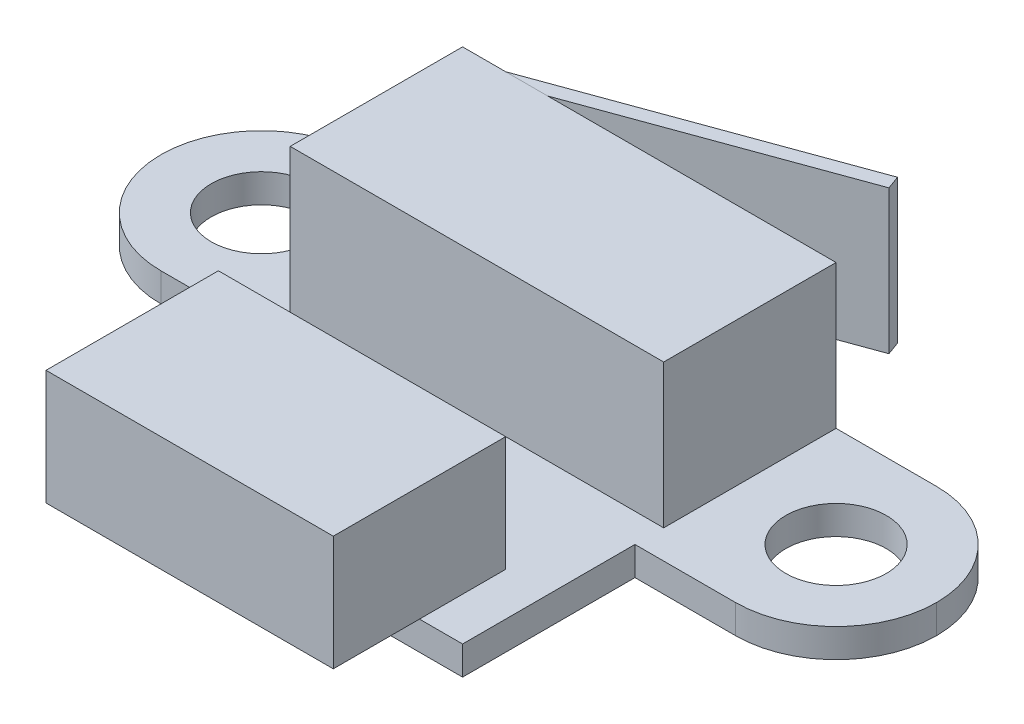
ISO-10303-21;
HEADER;
FILE_DESCRIPTION(('STEP AP214'),'2;1');
FILE_NAME('part.step','',(''),(''),'','','');
FILE_SCHEMA(('AUTOMOTIVE_DESIGN { 1 0 10303 214 1 1 1 1 }'));
ENDSEC;
DATA;
#1=APPLICATION_CONTEXT('core data for automotive mechanical design processes');
#2=APPLICATION_PROTOCOL_DEFINITION('international standard','automotive_design',2000,#1);
#3=PRODUCT_CONTEXT('',#1,'mechanical');
#4=PRODUCT('Part','Part','',(#3));
#5=PRODUCT_RELATED_PRODUCT_CATEGORY('part','',(#4));
#6=PRODUCT_DEFINITION_FORMATION('','',#4);
#7=PRODUCT_DEFINITION_CONTEXT('part definition',#1,'design');
#8=PRODUCT_DEFINITION('design','',#6,#7);
#9=PRODUCT_DEFINITION_SHAPE('','',#8);
#10=(LENGTH_UNIT() NAMED_UNIT(*) SI_UNIT(.MILLI.,.METRE.));
#11=(NAMED_UNIT(*) PLANE_ANGLE_UNIT() SI_UNIT($,.RADIAN.));
#12=(NAMED_UNIT(*) SI_UNIT($,.STERADIAN.) SOLID_ANGLE_UNIT());
#13=UNCERTAINTY_MEASURE_WITH_UNIT(LENGTH_MEASURE(1.E-05),#10,'distance_accuracy_value','');
#14=(GEOMETRIC_REPRESENTATION_CONTEXT(3) GLOBAL_UNCERTAINTY_ASSIGNED_CONTEXT((#13)) GLOBAL_UNIT_ASSIGNED_CONTEXT((#10,
#11,#12)) REPRESENTATION_CONTEXT('',''));
#15=CARTESIAN_POINT('',(0.,0.,0.));
#16=DIRECTION('',(0.,0.,1.));
#17=DIRECTION('',(1.,0.,0.));
#18=AXIS2_PLACEMENT_3D('',#15,#16,#17);
#19=CARTESIAN_POINT('',(-3.53809779991842,1.,-6.5));
#20=DIRECTION('',(0.,0.,1.));
#21=DIRECTION('',(1.,0.,0.));
#22=AXIS2_PLACEMENT_3D('',#19,#20,#21);
#23=PLANE('',#22);
#24=DIRECTION('',(1.,0.,0.));
#25=VECTOR('',#24,1.);
#26=CARTESIAN_POINT('',(-3.53809779991842,6.,-6.5));
#27=LINE('',#26,#25);
#28=CARTESIAN_POINT('',(-5.,6.,-6.5));
#29=VERTEX_POINT('',#28);
#30=CARTESIAN_POINT('',(-3.53809779991842,6.,-6.5));
#31=VERTEX_POINT('',#30);
#32=EDGE_CURVE('E106',#29,#31,#27,.T.);
#33=ORIENTED_EDGE('',*,*,#32,.F.);
#34=DIRECTION('',(0.,1.,0.));
#35=VECTOR('',#34,1.);
#36=CARTESIAN_POINT('',(-5.,1.,-6.5));
#37=LINE('',#36,#35);
#38=CARTESIAN_POINT('',(-5.,1.,-6.5));
#39=VERTEX_POINT('',#38);
#40=EDGE_CURVE('E12',#39,#29,#37,.T.);
#41=ORIENTED_EDGE('',*,*,#40,.F.);
#42=DIRECTION('',(1.,0.,0.));
#43=VECTOR('',#42,1.);
#44=CARTESIAN_POINT('',(-3.53809779991842,1.,-6.5));
#45=LINE('',#44,#43);
#46=CARTESIAN_POINT('',(-3.53809779991842,1.,-6.5));
#47=VERTEX_POINT('',#46);
#48=EDGE_CURVE('E100',#39,#47,#45,.T.);
#49=ORIENTED_EDGE('',*,*,#48,.T.);
#50=DIRECTION('',(0.,1.,0.));
#51=VECTOR('',#50,1.);
#52=CARTESIAN_POINT('',(-3.53809779991842,1.,-6.5));
#53=LINE('',#52,#51);
#54=EDGE_CURVE('E45',#47,#31,#53,.T.);
#55=ORIENTED_EDGE('',*,*,#54,.T.);
#56=EDGE_LOOP('',(#33,#41,#49,#55));
#57=FACE_BOUND('',#56,.T.);
#58=ADVANCED_FACE('F42',(#57),#23,.T.);
#59=CARTESIAN_POINT('',(-5.,1.,-6.5));
#60=DIRECTION('',(-0.342020143325663,0.,-0.93969262078591));
#61=DIRECTION('',(-0.93969262078591,0.,0.342020143325663));
#62=AXIS2_PLACEMENT_3D('',#59,#60,#61);
#63=PLANE('',#62);
#64=DIRECTION('',(-0.93969262078591,0.,0.342020143325663));
#65=VECTOR('',#64,1.);
#66=CARTESIAN_POINT('',(-5.,6.,-6.5));
#67=LINE('',#66,#65);
#68=CARTESIAN_POINT('',(5.,6.,-10.139702342662));
#69=VERTEX_POINT('',#68);
#70=EDGE_CURVE('E102',#69,#29,#67,.T.);
#71=ORIENTED_EDGE('',*,*,#70,.F.);
#72=DIRECTION('',(0.,1.,0.));
#73=VECTOR('',#72,1.);
#74=CARTESIAN_POINT('',(5.,1.,-10.139702342662));
#75=LINE('',#74,#73);
#76=CARTESIAN_POINT('',(5.,1.,-10.139702342662));
#77=VERTEX_POINT('',#76);
#78=EDGE_CURVE('E51',#77,#69,#75,.T.);
#79=ORIENTED_EDGE('',*,*,#78,.F.);
#80=DIRECTION('',(-0.93969262078591,0.,0.342020143325663));
#81=VECTOR('',#80,1.);
#82=CARTESIAN_POINT('',(-5.,1.,-6.5));
#83=LINE('',#82,#81);
#84=EDGE_CURVE('E97',#77,#39,#83,.T.);
#85=ORIENTED_EDGE('',*,*,#84,.T.);
#86=ORIENTED_EDGE('',*,*,#40,.T.);
#87=EDGE_LOOP('',(#71,#79,#85,#86));
#88=FACE_BOUND('',#87,.T.);
#89=ADVANCED_FACE('F116',(#88),#63,.T.);
#90=CARTESIAN_POINT('',(5.,1.,-10.139702342662));
#91=DIRECTION('',(0.939692620785911,0.,-0.342020143325663));
#92=DIRECTION('',(-0.342020143325663,0.,-0.939692620785911));
#93=AXIS2_PLACEMENT_3D('',#90,#91,#92);
#94=PLANE('',#93);
#95=DIRECTION('',(-0.342020143325663,0.,-0.939692620785911));
#96=VECTOR('',#95,1.);
#97=CARTESIAN_POINT('',(5.,6.,-10.139702342662));
#98=LINE('',#97,#96);
#99=CARTESIAN_POINT('',(5.17101007166283,6.,-9.669856032269));
#100=VERTEX_POINT('',#99);
#101=EDGE_CURVE('E92',#100,#69,#98,.T.);
#102=ORIENTED_EDGE('',*,*,#101,.F.);
#103=DIRECTION('',(0.,1.,0.));
#104=VECTOR('',#103,1.);
#105=CARTESIAN_POINT('',(5.17101007166283,1.,-9.669856032269));
#106=LINE('',#105,#104);
#107=CARTESIAN_POINT('',(5.17101007166283,1.,-9.669856032269));
#108=VERTEX_POINT('',#107);
#109=EDGE_CURVE('E87',#108,#100,#106,.T.);
#110=ORIENTED_EDGE('',*,*,#109,.F.);
#111=DIRECTION('',(-0.342020143325663,0.,-0.939692620785911));
#112=VECTOR('',#111,1.);
#113=CARTESIAN_POINT('',(5.,1.,-10.139702342662));
#114=LINE('',#113,#112);
#115=EDGE_CURVE('E90',#108,#77,#114,.T.);
#116=ORIENTED_EDGE('',*,*,#115,.T.);
#117=ORIENTED_EDGE('',*,*,#78,.T.);
#118=EDGE_LOOP('',(#102,#110,#116,#117));
#119=FACE_BOUND('',#118,.T.);
#120=ADVANCED_FACE('F89',(#119),#94,.T.);
#121=CARTESIAN_POINT('',(5.17101007166283,1.,-9.669856032269));
#122=DIRECTION('',(0.342020143325663,0.,0.93969262078591));
#123=DIRECTION('',(0.93969262078591,0.,-0.342020143325663));
#124=AXIS2_PLACEMENT_3D('',#121,#122,#123);
#125=PLANE('',#124);
#126=DIRECTION('',(0.93969262078591,0.,-0.342020143325663));
#127=VECTOR('',#126,1.);
#128=CARTESIAN_POINT('',(5.17101007166283,6.,-9.669856032269));
#129=LINE('',#128,#127);
#130=EDGE_CURVE('E109',#31,#100,#129,.T.);
#131=ORIENTED_EDGE('',*,*,#130,.F.);
#132=ORIENTED_EDGE('',*,*,#54,.F.);
#133=DIRECTION('',(0.93969262078591,0.,-0.342020143325663));
#134=VECTOR('',#133,1.);
#135=CARTESIAN_POINT('',(5.17101007166283,1.,-9.669856032269));
#136=LINE('',#135,#134);
#137=EDGE_CURVE('E96',#47,#108,#136,.T.);
#138=ORIENTED_EDGE('',*,*,#137,.T.);
#139=ORIENTED_EDGE('',*,*,#109,.T.);
#140=EDGE_LOOP('',(#131,#132,#138,#139));
#141=FACE_BOUND('',#140,.T.);
#142=ADVANCED_FACE('F99',(#141),#125,.T.);
#143=CARTESIAN_POINT('',(0.,0.999999999999998,0.));
#144=DIRECTION('',(0.,1.,0.));
#145=DIRECTION('',(0.,0.,1.));
#146=AXIS2_PLACEMENT_3D('',#143,#144,#145);
#147=PLANE('',#146);
#148=ORIENTED_EDGE('',*,*,#48,.F.);
#149=ORIENTED_EDGE('',*,*,#84,.F.);
#150=ORIENTED_EDGE('',*,*,#115,.F.);
#151=ORIENTED_EDGE('',*,*,#137,.F.);
#152=EDGE_LOOP('',(#148,#149,#150,#151));
#153=FACE_BOUND('',#152,.T.);
#154=ADVANCED_FACE('F95',(#153),#147,.F.);
#155=CARTESIAN_POINT('',(0.,6.,0.));
#156=DIRECTION('',(0.,1.,0.));
#157=DIRECTION('',(0.,0.,1.));
#158=AXIS2_PLACEMENT_3D('',#155,#156,#157);
#159=PLANE('',#158);
#160=ORIENTED_EDGE('',*,*,#32,.T.);
#161=ORIENTED_EDGE('',*,*,#130,.T.);
#162=ORIENTED_EDGE('',*,*,#101,.T.);
#163=ORIENTED_EDGE('',*,*,#70,.T.);
#164=EDGE_LOOP('',(#160,#161,#162,#163));
#165=FACE_BOUND('',#164,.T.);
#166=ADVANCED_FACE('F115',(#165),#159,.T.);
#167=CLOSED_SHELL('',(#58,#89,#120,#142,#154,#166));
#168=MANIFOLD_SOLID_BREP('B2',#167);
#169=CARTESIAN_POINT('',(0.,1.,0.));
#170=DIRECTION('',(0.,-1.,0.));
#171=DIRECTION('',(0.,0.,-1.));
#172=AXIS2_PLACEMENT_3D('',#169,#170,#171);
#173=PLANE('',#172);
#174=CARTESIAN_POINT('',(-10.,1.,-3.));
#175=DIRECTION('',(0.,1.,0.));
#176=DIRECTION('',(0.,0.,1.));
#177=AXIS2_PLACEMENT_3D('',#174,#175,#176);
#178=CIRCLE('',#177,1.75);
#179=CARTESIAN_POINT('',(-10.,1.,-1.25));
#180=VERTEX_POINT('',#179);
#181=EDGE_CURVE('E367',#180,#180,#178,.T.);
#182=ORIENTED_EDGE('',*,*,#181,.F.);
#183=EDGE_LOOP('',(#182));
#184=FACE_BOUND('',#183,.T.);
#185=CARTESIAN_POINT('',(10.,1.,-3.));
#186=DIRECTION('',(0.,1.,0.));
#187=DIRECTION('',(0.,0.,1.));
#188=AXIS2_PLACEMENT_3D('',#185,#186,#187);
#189=CIRCLE('',#188,1.75);
#190=CARTESIAN_POINT('',(10.,1.,-1.25));
#191=VERTEX_POINT('',#190);
#192=EDGE_CURVE('E362',#191,#191,#189,.T.);
#193=ORIENTED_EDGE('',*,*,#192,.F.);
#194=EDGE_LOOP('',(#193));
#195=FACE_BOUND('',#194,.T.);
#196=CARTESIAN_POINT('',(10.,1.,-3.));
#197=DIRECTION('',(0.,-1.,0.));
#198=DIRECTION('',(0.,0.,-1.));
#199=AXIS2_PLACEMENT_3D('',#196,#197,#198);
#200=CIRCLE('',#199,3.5);
#201=CARTESIAN_POINT('',(10.,0.999999999999999,0.500000000000001));
#202=VERTEX_POINT('',#201);
#203=CARTESIAN_POINT('',(13.5,1.,-3.));
#204=VERTEX_POINT('',#203);
#205=EDGE_CURVE('E421',#202,#204,#200,.F.);
#206=ORIENTED_EDGE('',*,*,#205,.T.);
#207=CARTESIAN_POINT('',(10.,1.,-3.));
#208=DIRECTION('',(0.,-1.,0.));
#209=DIRECTION('',(0.,0.,-1.));
#210=AXIS2_PLACEMENT_3D('',#207,#208,#209);
#211=CIRCLE('',#210,3.5);
#212=CARTESIAN_POINT('',(9.99999999999999,1.,-6.5));
#213=VERTEX_POINT('',#212);
#214=EDGE_CURVE('E423',#204,#213,#211,.F.);
#215=ORIENTED_EDGE('',*,*,#214,.T.);
#216=DIRECTION('',(-1.,0.,0.));
#217=VECTOR('',#216,1.);
#218=CARTESIAN_POINT('',(-6.5,1.,-6.5));
#219=LINE('',#218,#217);
#220=CARTESIAN_POINT('',(6.5,1.,-6.5));
#221=VERTEX_POINT('',#220);
#222=EDGE_CURVE('E394',#213,#221,#219,.T.);
#223=ORIENTED_EDGE('',*,*,#222,.T.);
#224=DIRECTION('',(0.,0.,-1.));
#225=VECTOR('',#224,1.);
#226=CARTESIAN_POINT('',(6.5,1.,-0.499999999999999));
#227=LINE('',#226,#225);
#228=CARTESIAN_POINT('',(6.5,1.,-0.499999999999999));
#229=VERTEX_POINT('',#228);
#230=EDGE_CURVE('E318',#229,#221,#227,.T.);
#231=ORIENTED_EDGE('',*,*,#230,.F.);
#232=DIRECTION('',(1.,0.,0.));
#233=VECTOR('',#232,1.);
#234=CARTESIAN_POINT('',(-6.5,1.,-0.499999999999999));
#235=LINE('',#234,#233);
#236=CARTESIAN_POINT('',(-6.5,1.,-0.499999999999999));
#237=VERTEX_POINT('',#236);
#238=EDGE_CURVE('E441',#237,#229,#235,.T.);
#239=ORIENTED_EDGE('',*,*,#238,.F.);
#240=DIRECTION('',(0.,0.,1.));
#241=VECTOR('',#240,1.);
#242=CARTESIAN_POINT('',(-6.5,1.,-0.499999999999999));
#243=LINE('',#242,#241);
#244=CARTESIAN_POINT('',(-6.5,1.,-6.5));
#245=VERTEX_POINT('',#244);
#246=EDGE_CURVE('E322',#245,#237,#243,.T.);
#247=ORIENTED_EDGE('',*,*,#246,.F.);
#248=CARTESIAN_POINT('',(-10.,1.,-6.5));
#249=VERTEX_POINT('',#248);
#250=EDGE_CURVE('E392',#245,#249,#219,.T.);
#251=ORIENTED_EDGE('',*,*,#250,.T.);
#252=CARTESIAN_POINT('',(-10.,1.,-3.));
#253=DIRECTION('',(0.,-1.,0.));
#254=DIRECTION('',(0.,0.,-1.));
#255=AXIS2_PLACEMENT_3D('',#252,#253,#254);
#256=CIRCLE('',#255,3.5);
#257=CARTESIAN_POINT('',(-13.5,1.,-3.));
#258=VERTEX_POINT('',#257);
#259=EDGE_CURVE('E417',#249,#258,#256,.F.);
#260=ORIENTED_EDGE('',*,*,#259,.T.);
#261=CARTESIAN_POINT('',(-10.,1.,-3.));
#262=DIRECTION('',(0.,-1.,0.));
#263=DIRECTION('',(0.,0.,-1.));
#264=AXIS2_PLACEMENT_3D('',#261,#262,#263);
#265=CIRCLE('',#264,3.5);
#266=CARTESIAN_POINT('',(-10.,1.,0.500000000000001));
#267=VERTEX_POINT('',#266);
#268=EDGE_CURVE('E419',#258,#267,#265,.F.);
#269=ORIENTED_EDGE('',*,*,#268,.T.);
#270=DIRECTION('',(1.,0.,0.));
#271=VECTOR('',#270,1.);
#272=CARTESIAN_POINT('',(-13.5,1.,0.500000000000001));
#273=LINE('',#272,#271);
#274=CARTESIAN_POINT('',(-6.5,1.,0.500000000000001));
#275=VERTEX_POINT('',#274);
#276=EDGE_CURVE('E384',#267,#275,#273,.T.);
#277=ORIENTED_EDGE('',*,*,#276,.T.);
#278=DIRECTION('',(0.,0.,1.));
#279=VECTOR('',#278,1.);
#280=CARTESIAN_POINT('',(-6.5,1.,6.5));
#281=LINE('',#280,#279);
#282=CARTESIAN_POINT('',(-6.5,1.,6.5));
#283=VERTEX_POINT('',#282);
#284=EDGE_CURVE('E396',#275,#283,#281,.T.);
#285=ORIENTED_EDGE('',*,*,#284,.T.);
#286=DIRECTION('',(1.,0.,0.));
#287=VECTOR('',#286,1.);
#288=CARTESIAN_POINT('',(-6.5,1.,6.5));
#289=LINE('',#288,#287);
#290=CARTESIAN_POINT('',(-5.,1.,6.5));
#291=VERTEX_POINT('',#290);
#292=EDGE_CURVE('E399',#283,#291,#289,.T.);
#293=ORIENTED_EDGE('',*,*,#292,.T.);
#294=DIRECTION('',(0.,0.,1.));
#295=VECTOR('',#294,1.);
#296=CARTESIAN_POINT('',(-5.,1.,3.5));
#297=LINE('',#296,#295);
#298=CARTESIAN_POINT('',(-5.,1.,3.5));
#299=VERTEX_POINT('',#298);
#300=EDGE_CURVE('E325',#299,#291,#297,.T.);
#301=ORIENTED_EDGE('',*,*,#300,.F.);
#302=DIRECTION('',(-1.,0.,0.));
#303=VECTOR('',#302,1.);
#304=CARTESIAN_POINT('',(-5.,1.,3.5));
#305=LINE('',#304,#303);
#306=CARTESIAN_POINT('',(5.,1.,3.5));
#307=VERTEX_POINT('',#306);
#308=EDGE_CURVE('E335',#307,#299,#305,.T.);
#309=ORIENTED_EDGE('',*,*,#308,.F.);
#310=DIRECTION('',(0.,0.,-1.));
#311=VECTOR('',#310,1.);
#312=CARTESIAN_POINT('',(5.,1.,3.5));
#313=LINE('',#312,#311);
#314=CARTESIAN_POINT('',(5.,1.,6.5));
#315=VERTEX_POINT('',#314);
#316=EDGE_CURVE('E348',#315,#307,#313,.T.);
#317=ORIENTED_EDGE('',*,*,#316,.F.);
#318=CARTESIAN_POINT('',(6.5,1.,6.5));
#319=VERTEX_POINT('',#318);
#320=EDGE_CURVE('E398',#315,#319,#289,.T.);
#321=ORIENTED_EDGE('',*,*,#320,.T.);
#322=DIRECTION('',(0.,0.,-1.));
#323=VECTOR('',#322,1.);
#324=CARTESIAN_POINT('',(6.5,1.,6.5));
#325=LINE('',#324,#323);
#326=CARTESIAN_POINT('',(6.5,1.,0.500000000000003));
#327=VERTEX_POINT('',#326);
#328=EDGE_CURVE('E389',#319,#327,#325,.T.);
#329=ORIENTED_EDGE('',*,*,#328,.T.);
#330=DIRECTION('',(-1.,0.,0.));
#331=VECTOR('',#330,1.);
#332=CARTESIAN_POINT('',(13.5,0.999999999999999,0.500000000000001));
#333=LINE('',#332,#331);
#334=EDGE_CURVE('E379',#202,#327,#333,.T.);
#335=ORIENTED_EDGE('',*,*,#334,.F.);
#336=EDGE_LOOP('',(#206,#215,#223,#231,#239,#247,#251,#260,#269,#277,#285,#293,#301,#309,#317,
#321,#329,#335));
#337=FACE_BOUND('',#336,.T.);
#338=ADVANCED_FACE('F166',(#184,#195,#337),#173,.F.);
#339=CARTESIAN_POINT('',(6.5,1.,6.5));
#340=DIRECTION('',(-1.,0.,0.));
#341=DIRECTION('',(0.,0.,1.));
#342=AXIS2_PLACEMENT_3D('',#339,#340,#341);
#343=PLANE('',#342);
#344=DIRECTION('',(0.,-1.,0.));
#345=VECTOR('',#344,1.);
#346=CARTESIAN_POINT('',(6.5,0.999999999999999,0.500000000000001));
#347=LINE('',#346,#345);
#348=CARTESIAN_POINT('',(6.5,0.,0.500000000000001));
#349=VERTEX_POINT('',#348);
#350=EDGE_CURVE('E366',#327,#349,#347,.T.);
#351=ORIENTED_EDGE('',*,*,#350,.F.);
#352=ORIENTED_EDGE('',*,*,#328,.F.);
#353=DIRECTION('',(0.,-1.,0.));
#354=VECTOR('',#353,1.);
#355=CARTESIAN_POINT('',(6.5,1.,6.5));
#356=LINE('',#355,#354);
#357=CARTESIAN_POINT('',(6.5,0.,6.5));
#358=VERTEX_POINT('',#357);
#359=EDGE_CURVE('E402',#319,#358,#356,.T.);
#360=ORIENTED_EDGE('',*,*,#359,.T.);
#361=DIRECTION('',(0.,0.,-1.));
#362=VECTOR('',#361,1.);
#363=CARTESIAN_POINT('',(6.5,0.,6.5));
#364=LINE('',#363,#362);
#365=EDGE_CURVE('E388',#358,#349,#364,.T.);
#366=ORIENTED_EDGE('',*,*,#365,.T.);
#367=EDGE_LOOP('',(#351,#352,#360,#366));
#368=FACE_BOUND('',#367,.T.);
#369=ADVANCED_FACE('F475',(#368),#343,.F.);
#370=CARTESIAN_POINT('',(-6.5,1.,6.5));
#371=DIRECTION('',(1.,0.,0.));
#372=DIRECTION('',(0.,0.,-1.));
#373=AXIS2_PLACEMENT_3D('',#370,#371,#372);
#374=PLANE('',#373);
#375=DIRECTION('',(0.,1.,0.));
#376=VECTOR('',#375,1.);
#377=CARTESIAN_POINT('',(-6.5,0.,0.500000000000001));
#378=LINE('',#377,#376);
#379=CARTESIAN_POINT('',(-6.5,0.,0.500000000000003));
#380=VERTEX_POINT('',#379);
#381=EDGE_CURVE('E381',#380,#275,#378,.T.);
#382=ORIENTED_EDGE('',*,*,#381,.F.);
#383=DIRECTION('',(0.,0.,1.));
#384=VECTOR('',#383,1.);
#385=CARTESIAN_POINT('',(-6.5,0.,6.5));
#386=LINE('',#385,#384);
#387=CARTESIAN_POINT('',(-6.5,0.,6.5));
#388=VERTEX_POINT('',#387);
#389=EDGE_CURVE('E409',#380,#388,#386,.T.);
#390=ORIENTED_EDGE('',*,*,#389,.T.);
#391=DIRECTION('',(0.,-1.,0.));
#392=VECTOR('',#391,1.);
#393=CARTESIAN_POINT('',(-6.5,1.,6.5));
#394=LINE('',#393,#392);
#395=EDGE_CURVE('E414',#283,#388,#394,.T.);
#396=ORIENTED_EDGE('',*,*,#395,.F.);
#397=ORIENTED_EDGE('',*,*,#284,.F.);
#398=EDGE_LOOP('',(#382,#390,#396,#397));
#399=FACE_BOUND('',#398,.T.);
#400=ADVANCED_FACE('F487',(#399),#374,.F.);
#401=CARTESIAN_POINT('',(-6.5,1.,-6.5));
#402=DIRECTION('',(0.,0.,1.));
#403=DIRECTION('',(1.,0.,0.));
#404=AXIS2_PLACEMENT_3D('',#401,#402,#403);
#405=PLANE('',#404);
#406=ORIENTED_EDGE('',*,*,#222,.F.);
#407=DIRECTION('',(0.,1.,0.));
#408=VECTOR('',#407,1.);
#409=CARTESIAN_POINT('',(10.,1.,-6.5));
#410=LINE('',#409,#408);
#411=CARTESIAN_POINT('',(9.99999999999999,0.,-6.5));
#412=VERTEX_POINT('',#411);
#413=EDGE_CURVE('E427',#213,#412,#410,.F.);
#414=ORIENTED_EDGE('',*,*,#413,.T.);
#415=DIRECTION('',(-1.,0.,0.));
#416=VECTOR('',#415,1.);
#417=CARTESIAN_POINT('',(-6.5,0.,-6.5));
#418=LINE('',#417,#416);
#419=CARTESIAN_POINT('',(-10.,0.,-6.5));
#420=VERTEX_POINT('',#419);
#421=EDGE_CURVE('E406',#412,#420,#418,.T.);
#422=ORIENTED_EDGE('',*,*,#421,.T.);
#423=DIRECTION('',(0.,-1.,0.));
#424=VECTOR('',#423,1.);
#425=CARTESIAN_POINT('',(-10.,1.,-6.5));
#426=LINE('',#425,#424);
#427=EDGE_CURVE('E425',#420,#249,#426,.F.);
#428=ORIENTED_EDGE('',*,*,#427,.T.);
#429=ORIENTED_EDGE('',*,*,#250,.F.);
#430=DIRECTION('',(0.,-1.,0.));
#431=VECTOR('',#430,1.);
#432=CARTESIAN_POINT('',(-6.5,6.,-6.5));
#433=LINE('',#432,#431);
#434=CARTESIAN_POINT('',(-6.5,6.,-6.5));
#435=VERTEX_POINT('',#434);
#436=EDGE_CURVE('E492',#435,#245,#433,.T.);
#437=ORIENTED_EDGE('',*,*,#436,.F.);
#438=DIRECTION('',(-1.,0.,0.));
#439=VECTOR('',#438,1.);
#440=CARTESIAN_POINT('',(-6.5,6.,-6.5));
#441=LINE('',#440,#439);
#442=CARTESIAN_POINT('',(6.5,6.,-6.5));
#443=VERTEX_POINT('',#442);
#444=EDGE_CURVE('E314',#443,#435,#441,.T.);
#445=ORIENTED_EDGE('',*,*,#444,.F.);
#446=DIRECTION('',(0.,-1.,0.));
#447=VECTOR('',#446,1.);
#448=CARTESIAN_POINT('',(6.5,6.,-6.5));
#449=LINE('',#448,#447);
#450=EDGE_CURVE('E327',#443,#221,#449,.T.);
#451=ORIENTED_EDGE('',*,*,#450,.T.);
#452=EDGE_LOOP('',(#406,#414,#422,#428,#429,#437,#445,#451));
#453=FACE_BOUND('',#452,.T.);
#454=ADVANCED_FACE('F457',(#453),#405,.F.);
#455=CARTESIAN_POINT('',(-6.5,1.,6.5));
#456=DIRECTION('',(0.,0.,-1.));
#457=DIRECTION('',(-1.,0.,0.));
#458=AXIS2_PLACEMENT_3D('',#455,#456,#457);
#459=PLANE('',#458);
#460=DIRECTION('',(1.,0.,0.));
#461=VECTOR('',#460,1.);
#462=CARTESIAN_POINT('',(-6.5,0.,6.5));
#463=LINE('',#462,#461);
#464=EDGE_CURVE('E393',#388,#358,#463,.T.);
#465=ORIENTED_EDGE('',*,*,#464,.T.);
#466=ORIENTED_EDGE('',*,*,#359,.F.);
#467=ORIENTED_EDGE('',*,*,#320,.F.);
#468=EDGE_CURVE('E403',#291,#315,#289,.T.);
#469=ORIENTED_EDGE('',*,*,#468,.F.);
#470=ORIENTED_EDGE('',*,*,#292,.F.);
#471=ORIENTED_EDGE('',*,*,#395,.T.);
#472=EDGE_LOOP('',(#465,#466,#467,#469,#470,#471));
#473=FACE_BOUND('',#472,.T.);
#474=ADVANCED_FACE('F480',(#473),#459,.F.);
#475=CARTESIAN_POINT('',(0.,0.,0.));
#476=DIRECTION('',(0.,-1.,0.));
#477=DIRECTION('',(0.,0.,-1.));
#478=AXIS2_PLACEMENT_3D('',#475,#476,#477);
#479=PLANE('',#478);
#480=CARTESIAN_POINT('',(-10.,0.,-3.));
#481=DIRECTION('',(0.,1.,0.));
#482=DIRECTION('',(0.,0.,1.));
#483=AXIS2_PLACEMENT_3D('',#480,#481,#482);
#484=CIRCLE('',#483,1.75);
#485=CARTESIAN_POINT('',(-10.,0.,-1.25));
#486=VERTEX_POINT('',#485);
#487=EDGE_CURVE('E363',#486,#486,#484,.T.);
#488=ORIENTED_EDGE('',*,*,#487,.T.);
#489=EDGE_LOOP('',(#488));
#490=FACE_BOUND('',#489,.T.);
#491=CARTESIAN_POINT('',(10.,0.,-3.));
#492=DIRECTION('',(0.,1.,0.));
#493=DIRECTION('',(0.,0.,1.));
#494=AXIS2_PLACEMENT_3D('',#491,#492,#493);
#495=CIRCLE('',#494,1.75);
#496=CARTESIAN_POINT('',(10.,0.,-1.25));
#497=VERTEX_POINT('',#496);
#498=EDGE_CURVE('E370',#497,#497,#495,.T.);
#499=ORIENTED_EDGE('',*,*,#498,.T.);
#500=EDGE_LOOP('',(#499));
#501=FACE_BOUND('',#500,.T.);
#502=ORIENTED_EDGE('',*,*,#421,.F.);
#503=CARTESIAN_POINT('',(10.,0.,-3.));
#504=DIRECTION('',(0.,-1.,0.));
#505=DIRECTION('',(0.,0.,-1.));
#506=AXIS2_PLACEMENT_3D('',#503,#504,#505);
#507=CIRCLE('',#506,3.5);
#508=CARTESIAN_POINT('',(13.5,0.,-3.));
#509=VERTEX_POINT('',#508);
#510=EDGE_CURVE('E188',#412,#509,#507,.T.);
#511=ORIENTED_EDGE('',*,*,#510,.T.);
#512=CARTESIAN_POINT('',(10.,0.,-3.));
#513=DIRECTION('',(0.,-1.,0.));
#514=DIRECTION('',(0.,0.,-1.));
#515=AXIS2_PLACEMENT_3D('',#512,#513,#514);
#516=CIRCLE('',#515,3.5);
#517=CARTESIAN_POINT('',(10.,0.,0.500000000000001));
#518=VERTEX_POINT('',#517);
#519=EDGE_CURVE('E183',#509,#518,#516,.T.);
#520=ORIENTED_EDGE('',*,*,#519,.T.);
#521=DIRECTION('',(-1.,0.,0.));
#522=VECTOR('',#521,1.);
#523=CARTESIAN_POINT('',(13.5,0.,0.500000000000001));
#524=LINE('',#523,#522);
#525=EDGE_CURVE('E377',#518,#349,#524,.T.);
#526=ORIENTED_EDGE('',*,*,#525,.T.);
#527=ORIENTED_EDGE('',*,*,#365,.F.);
#528=ORIENTED_EDGE('',*,*,#464,.F.);
#529=ORIENTED_EDGE('',*,*,#389,.F.);
#530=DIRECTION('',(1.,0.,0.));
#531=VECTOR('',#530,1.);
#532=CARTESIAN_POINT('',(-13.5,0.,0.500000000000001));
#533=LINE('',#532,#531);
#534=CARTESIAN_POINT('',(-10.,0.,0.500000000000001));
#535=VERTEX_POINT('',#534);
#536=EDGE_CURVE('E386',#535,#380,#533,.T.);
#537=ORIENTED_EDGE('',*,*,#536,.F.);
#538=CARTESIAN_POINT('',(-10.,0.,-3.));
#539=DIRECTION('',(0.,-1.,0.));
#540=DIRECTION('',(0.,0.,-1.));
#541=AXIS2_PLACEMENT_3D('',#538,#539,#540);
#542=CIRCLE('',#541,3.5);
#543=CARTESIAN_POINT('',(-13.5,0.,-3.));
#544=VERTEX_POINT('',#543);
#545=EDGE_CURVE('E432',#535,#544,#542,.T.);
#546=ORIENTED_EDGE('',*,*,#545,.T.);
#547=CARTESIAN_POINT('',(-10.,0.,-3.));
#548=DIRECTION('',(0.,-1.,0.));
#549=DIRECTION('',(0.,0.,-1.));
#550=AXIS2_PLACEMENT_3D('',#547,#548,#549);
#551=CIRCLE('',#550,3.5);
#552=EDGE_CURVE('E430',#544,#420,#551,.T.);
#553=ORIENTED_EDGE('',*,*,#552,.T.);
#554=EDGE_LOOP('',(#502,#511,#520,#526,#527,#528,#529,#537,#546,#553));
#555=FACE_BOUND('',#554,.T.);
#556=ADVANCED_FACE('F453',(#490,#501,#555),#479,.T.);
#557=CARTESIAN_POINT('',(-13.5,0.,0.500000000000001));
#558=DIRECTION('',(0.,0.,-1.));
#559=DIRECTION('',(-1.,0.,0.));
#560=AXIS2_PLACEMENT_3D('',#557,#558,#559);
#561=PLANE('',#560);
#562=ORIENTED_EDGE('',*,*,#276,.F.);
#563=DIRECTION('',(0.,1.,0.));
#564=VECTOR('',#563,1.);
#565=CARTESIAN_POINT('',(-10.,0.,0.500000000000001));
#566=LINE('',#565,#564);
#567=EDGE_CURVE('E40',#267,#535,#566,.F.);
#568=ORIENTED_EDGE('',*,*,#567,.T.);
#569=ORIENTED_EDGE('',*,*,#536,.T.);
#570=ORIENTED_EDGE('',*,*,#381,.T.);
#571=EDGE_LOOP('',(#562,#568,#569,#570));
#572=FACE_BOUND('',#571,.T.);
#573=ADVANCED_FACE('F491',(#572),#561,.F.);
#574=CARTESIAN_POINT('',(13.5,0.999999999999999,0.500000000000001));
#575=DIRECTION('',(0.,0.,-1.));
#576=DIRECTION('',(-1.,0.,0.));
#577=AXIS2_PLACEMENT_3D('',#574,#575,#576);
#578=PLANE('',#577);
#579=ORIENTED_EDGE('',*,*,#525,.F.);
#580=DIRECTION('',(0.,-1.,0.));
#581=VECTOR('',#580,1.);
#582=CARTESIAN_POINT('',(10.,0.999999999999999,0.500000000000001));
#583=LINE('',#582,#581);
#584=EDGE_CURVE('E175',#518,#202,#583,.F.);
#585=ORIENTED_EDGE('',*,*,#584,.T.);
#586=ORIENTED_EDGE('',*,*,#334,.T.);
#587=ORIENTED_EDGE('',*,*,#350,.T.);
#588=EDGE_LOOP('',(#579,#585,#586,#587));
#589=FACE_BOUND('',#588,.T.);
#590=ADVANCED_FACE('F470',(#589),#578,.F.);
#591=CARTESIAN_POINT('',(10.,0.,-3.));
#592=DIRECTION('',(0.,1.,0.));
#593=DIRECTION('',(0.,0.,1.));
#594=AXIS2_PLACEMENT_3D('',#591,#592,#593);
#595=CYLINDRICAL_SURFACE('',#594,1.75);
#596=ORIENTED_EDGE('',*,*,#498,.F.);
#597=EDGE_LOOP('',(#596));
#598=FACE_BOUND('',#597,.T.);
#599=ORIENTED_EDGE('',*,*,#192,.T.);
#600=EDGE_LOOP('',(#599));
#601=FACE_BOUND('',#600,.T.);
#602=ADVANCED_FACE('F652',(#598,#601),#595,.F.);
#603=CARTESIAN_POINT('',(-10.,0.,-3.));
#604=DIRECTION('',(0.,1.,0.));
#605=DIRECTION('',(0.,0.,1.));
#606=AXIS2_PLACEMENT_3D('',#603,#604,#605);
#607=CYLINDRICAL_SURFACE('',#606,1.75);
#608=ORIENTED_EDGE('',*,*,#487,.F.);
#609=EDGE_LOOP('',(#608));
#610=FACE_BOUND('',#609,.T.);
#611=ORIENTED_EDGE('',*,*,#181,.T.);
#612=EDGE_LOOP('',(#611));
#613=FACE_BOUND('',#612,.T.);
#614=ADVANCED_FACE('F632',(#610,#613),#607,.F.);
#615=CARTESIAN_POINT('',(0.,1.,0.));
#616=DIRECTION('',(0.,1.,0.));
#617=DIRECTION('',(0.,0.,1.));
#618=AXIS2_PLACEMENT_3D('',#615,#616,#617);
#619=PLANE('',#618);
#620=CARTESIAN_POINT('',(-5.,1.,9.5));
#621=VERTEX_POINT('',#620);
#622=EDGE_CURVE('E323',#291,#621,#297,.T.);
#623=ORIENTED_EDGE('',*,*,#622,.F.);
#624=ORIENTED_EDGE('',*,*,#468,.T.);
#625=CARTESIAN_POINT('',(5.,1.,9.5));
#626=VERTEX_POINT('',#625);
#627=EDGE_CURVE('E345',#626,#315,#313,.T.);
#628=ORIENTED_EDGE('',*,*,#627,.F.);
#629=DIRECTION('',(1.,0.,0.));
#630=VECTOR('',#629,1.);
#631=CARTESIAN_POINT('',(-5.,1.,9.5));
#632=LINE('',#631,#630);
#633=EDGE_CURVE('E343',#621,#626,#632,.T.);
#634=ORIENTED_EDGE('',*,*,#633,.F.);
#635=EDGE_LOOP('',(#623,#624,#628,#634));
#636=FACE_BOUND('',#635,.T.);
#637=ADVANCED_FACE('F622',(#636),#619,.F.);
#638=CARTESIAN_POINT('',(-5.,5.,3.5));
#639=DIRECTION('',(1.,0.,0.));
#640=DIRECTION('',(0.,0.,-1.));
#641=AXIS2_PLACEMENT_3D('',#638,#639,#640);
#642=PLANE('',#641);
#643=ORIENTED_EDGE('',*,*,#300,.T.);
#644=ORIENTED_EDGE('',*,*,#622,.T.);
#645=DIRECTION('',(0.,-1.,0.));
#646=VECTOR('',#645,1.);
#647=CARTESIAN_POINT('',(-5.,5.,9.5));
#648=LINE('',#647,#646);
#649=CARTESIAN_POINT('',(-5.,5.,9.5));
#650=VERTEX_POINT('',#649);
#651=EDGE_CURVE('E359',#650,#621,#648,.T.);
#652=ORIENTED_EDGE('',*,*,#651,.F.);
#653=DIRECTION('',(0.,0.,1.));
#654=VECTOR('',#653,1.);
#655=CARTESIAN_POINT('',(-5.,5.,3.5));
#656=LINE('',#655,#654);
#657=CARTESIAN_POINT('',(-5.,5.,3.5));
#658=VERTEX_POINT('',#657);
#659=EDGE_CURVE('E331',#658,#650,#656,.T.);
#660=ORIENTED_EDGE('',*,*,#659,.F.);
#661=DIRECTION('',(0.,-1.,0.));
#662=VECTOR('',#661,1.);
#663=CARTESIAN_POINT('',(-5.,5.,3.5));
#664=LINE('',#663,#662);
#665=EDGE_CURVE('E340',#658,#299,#664,.T.);
#666=ORIENTED_EDGE('',*,*,#665,.T.);
#667=EDGE_LOOP('',(#643,#644,#652,#660,#666));
#668=FACE_BOUND('',#667,.T.);
#669=ADVANCED_FACE('F612',(#668),#642,.F.);
#670=CARTESIAN_POINT('',(-5.,5.,9.5));
#671=DIRECTION('',(0.,0.,-1.));
#672=DIRECTION('',(-1.,0.,0.));
#673=AXIS2_PLACEMENT_3D('',#670,#671,#672);
#674=PLANE('',#673);
#675=ORIENTED_EDGE('',*,*,#633,.T.);
#676=DIRECTION('',(0.,-1.,0.));
#677=VECTOR('',#676,1.);
#678=CARTESIAN_POINT('',(5.,5.,9.5));
#679=LINE('',#678,#677);
#680=CARTESIAN_POINT('',(5.,5.,9.5));
#681=VERTEX_POINT('',#680);
#682=EDGE_CURVE('E356',#681,#626,#679,.T.);
#683=ORIENTED_EDGE('',*,*,#682,.F.);
#684=DIRECTION('',(1.,0.,0.));
#685=VECTOR('',#684,1.);
#686=CARTESIAN_POINT('',(-5.,5.,9.5));
#687=LINE('',#686,#685);
#688=EDGE_CURVE('E334',#650,#681,#687,.T.);
#689=ORIENTED_EDGE('',*,*,#688,.F.);
#690=ORIENTED_EDGE('',*,*,#651,.T.);
#691=EDGE_LOOP('',(#675,#683,#689,#690));
#692=FACE_BOUND('',#691,.T.);
#693=ADVANCED_FACE('F602',(#692),#674,.F.);
#694=CARTESIAN_POINT('',(5.,5.,3.5));
#695=DIRECTION('',(-1.,0.,0.));
#696=DIRECTION('',(0.,0.,1.));
#697=AXIS2_PLACEMENT_3D('',#694,#695,#696);
#698=PLANE('',#697);
#699=ORIENTED_EDGE('',*,*,#627,.T.);
#700=ORIENTED_EDGE('',*,*,#316,.T.);
#701=DIRECTION('',(0.,-1.,0.));
#702=VECTOR('',#701,1.);
#703=CARTESIAN_POINT('',(5.,5.,3.5));
#704=LINE('',#703,#702);
#705=CARTESIAN_POINT('',(5.,5.,3.5));
#706=VERTEX_POINT('',#705);
#707=EDGE_CURVE('E353',#706,#307,#704,.T.);
#708=ORIENTED_EDGE('',*,*,#707,.F.);
#709=DIRECTION('',(0.,0.,-1.));
#710=VECTOR('',#709,1.);
#711=CARTESIAN_POINT('',(5.,5.,3.5));
#712=LINE('',#711,#710);
#713=EDGE_CURVE('E337',#681,#706,#712,.T.);
#714=ORIENTED_EDGE('',*,*,#713,.F.);
#715=ORIENTED_EDGE('',*,*,#682,.T.);
#716=EDGE_LOOP('',(#699,#700,#708,#714,#715));
#717=FACE_BOUND('',#716,.T.);
#718=ADVANCED_FACE('F592',(#717),#698,.F.);
#719=CARTESIAN_POINT('',(-5.,5.,3.5));
#720=DIRECTION('',(0.,0.,1.));
#721=DIRECTION('',(1.,0.,0.));
#722=AXIS2_PLACEMENT_3D('',#719,#720,#721);
#723=PLANE('',#722);
#724=ORIENTED_EDGE('',*,*,#308,.T.);
#725=ORIENTED_EDGE('',*,*,#665,.F.);
#726=DIRECTION('',(-1.,0.,0.));
#727=VECTOR('',#726,1.);
#728=CARTESIAN_POINT('',(-5.,5.,3.5));
#729=LINE('',#728,#727);
#730=EDGE_CURVE('E339',#706,#658,#729,.T.);
#731=ORIENTED_EDGE('',*,*,#730,.F.);
#732=ORIENTED_EDGE('',*,*,#707,.T.);
#733=EDGE_LOOP('',(#724,#725,#731,#732));
#734=FACE_BOUND('',#733,.T.);
#735=ADVANCED_FACE('F581',(#734),#723,.F.);
#736=CARTESIAN_POINT('',(0.,5.,0.));
#737=DIRECTION('',(0.,1.,0.));
#738=DIRECTION('',(0.,0.,1.));
#739=AXIS2_PLACEMENT_3D('',#736,#737,#738);
#740=PLANE('',#739);
#741=ORIENTED_EDGE('',*,*,#659,.T.);
#742=ORIENTED_EDGE('',*,*,#688,.T.);
#743=ORIENTED_EDGE('',*,*,#713,.T.);
#744=ORIENTED_EDGE('',*,*,#730,.T.);
#745=EDGE_LOOP('',(#741,#742,#743,#744));
#746=FACE_BOUND('',#745,.T.);
#747=ADVANCED_FACE('F571',(#746),#740,.T.);
#748=CARTESIAN_POINT('',(-6.5,6.,-0.499999999999999));
#749=DIRECTION('',(1.,0.,0.));
#750=DIRECTION('',(0.,0.,-1.));
#751=AXIS2_PLACEMENT_3D('',#748,#749,#750);
#752=PLANE('',#751);
#753=ORIENTED_EDGE('',*,*,#246,.T.);
#754=DIRECTION('',(0.,-1.,0.));
#755=VECTOR('',#754,1.);
#756=CARTESIAN_POINT('',(-6.5,6.,-0.499999999999999));
#757=LINE('',#756,#755);
#758=CARTESIAN_POINT('',(-6.5,6.,-0.499999999999999));
#759=VERTEX_POINT('',#758);
#760=EDGE_CURVE('E302',#759,#237,#757,.T.);
#761=ORIENTED_EDGE('',*,*,#760,.F.);
#762=DIRECTION('',(0.,0.,1.));
#763=VECTOR('',#762,1.);
#764=CARTESIAN_POINT('',(-6.5,6.,-0.499999999999999));
#765=LINE('',#764,#763);
#766=EDGE_CURVE('E309',#435,#759,#765,.T.);
#767=ORIENTED_EDGE('',*,*,#766,.F.);
#768=ORIENTED_EDGE('',*,*,#436,.T.);
#769=EDGE_LOOP('',(#753,#761,#767,#768));
#770=FACE_BOUND('',#769,.T.);
#771=ADVANCED_FACE('F320',(#770),#752,.F.);
#772=CARTESIAN_POINT('',(-6.5,6.,-0.499999999999999));
#773=DIRECTION('',(0.,0.,-1.));
#774=DIRECTION('',(-1.,0.,0.));
#775=AXIS2_PLACEMENT_3D('',#772,#773,#774);
#776=PLANE('',#775);
#777=ORIENTED_EDGE('',*,*,#238,.T.);
#778=DIRECTION('',(0.,-1.,0.));
#779=VECTOR('',#778,1.);
#780=CARTESIAN_POINT('',(6.5,6.,-0.499999999999999));
#781=LINE('',#780,#779);
#782=CARTESIAN_POINT('',(6.5,6.,-0.499999999999999));
#783=VERTEX_POINT('',#782);
#784=EDGE_CURVE('E305',#783,#229,#781,.T.);
#785=ORIENTED_EDGE('',*,*,#784,.F.);
#786=DIRECTION('',(1.,0.,0.));
#787=VECTOR('',#786,1.);
#788=CARTESIAN_POINT('',(-6.5,6.,-0.499999999999999));
#789=LINE('',#788,#787);
#790=EDGE_CURVE('E297',#759,#783,#789,.T.);
#791=ORIENTED_EDGE('',*,*,#790,.F.);
#792=ORIENTED_EDGE('',*,*,#760,.T.);
#793=EDGE_LOOP('',(#777,#785,#791,#792));
#794=FACE_BOUND('',#793,.T.);
#795=ADVANCED_FACE('F300',(#794),#776,.F.);
#796=CARTESIAN_POINT('',(6.5,6.,-0.499999999999999));
#797=DIRECTION('',(-1.,0.,0.));
#798=DIRECTION('',(0.,0.,1.));
#799=AXIS2_PLACEMENT_3D('',#796,#797,#798);
#800=PLANE('',#799);
#801=ORIENTED_EDGE('',*,*,#230,.T.);
#802=ORIENTED_EDGE('',*,*,#450,.F.);
#803=DIRECTION('',(0.,0.,-1.));
#804=VECTOR('',#803,1.);
#805=CARTESIAN_POINT('',(6.5,6.,-0.499999999999999));
#806=LINE('',#805,#804);
#807=EDGE_CURVE('E308',#783,#443,#806,.T.);
#808=ORIENTED_EDGE('',*,*,#807,.F.);
#809=ORIENTED_EDGE('',*,*,#784,.T.);
#810=EDGE_LOOP('',(#801,#802,#808,#809));
#811=FACE_BOUND('',#810,.T.);
#812=ADVANCED_FACE('F500',(#811),#800,.F.);
#813=CARTESIAN_POINT('',(0.,6.,0.));
#814=DIRECTION('',(0.,-1.,0.));
#815=DIRECTION('',(0.,0.,-1.));
#816=AXIS2_PLACEMENT_3D('',#813,#814,#815);
#817=PLANE('',#816);
#818=ORIENTED_EDGE('',*,*,#766,.T.);
#819=ORIENTED_EDGE('',*,*,#790,.T.);
#820=ORIENTED_EDGE('',*,*,#807,.T.);
#821=ORIENTED_EDGE('',*,*,#444,.T.);
#822=EDGE_LOOP('',(#818,#819,#820,#821));
#823=FACE_BOUND('',#822,.T.);
#824=ADVANCED_FACE('F312',(#823),#817,.F.);
#825=CARTESIAN_POINT('',(10.,0.,-3.));
#826=DIRECTION('',(0.,-1.,0.));
#827=DIRECTION('',(0.,0.,-1.));
#828=AXIS2_PLACEMENT_3D('',#825,#826,#827);
#829=CYLINDRICAL_SURFACE('',#828,3.5);
#830=ORIENTED_EDGE('',*,*,#584,.F.);
#831=ORIENTED_EDGE('',*,*,#519,.F.);
#832=DIRECTION('',(0.,-1.,0.));
#833=VECTOR('',#832,1.);
#834=CARTESIAN_POINT('',(13.5,0.,-3.));
#835=LINE('',#834,#833);
#836=EDGE_CURVE('E436',#204,#509,#835,.T.);
#837=ORIENTED_EDGE('',*,*,#836,.F.);
#838=ORIENTED_EDGE('',*,*,#205,.F.);
#839=EDGE_LOOP('',(#830,#831,#837,#838));
#840=FACE_BOUND('',#839,.T.);
#841=ADVANCED_FACE('F468',(#840),#829,.T.);
#842=CARTESIAN_POINT('',(10.,0.,-3.));
#843=DIRECTION('',(0.,1.,0.));
#844=DIRECTION('',(0.,0.,1.));
#845=AXIS2_PLACEMENT_3D('',#842,#843,#844);
#846=CYLINDRICAL_SURFACE('',#845,3.5);
#847=ORIENTED_EDGE('',*,*,#510,.F.);
#848=ORIENTED_EDGE('',*,*,#413,.F.);
#849=ORIENTED_EDGE('',*,*,#214,.F.);
#850=ORIENTED_EDGE('',*,*,#836,.T.);
#851=EDGE_LOOP('',(#847,#848,#849,#850));
#852=FACE_BOUND('',#851,.T.);
#853=ADVANCED_FACE('F461',(#852),#846,.T.);
#854=CARTESIAN_POINT('',(-10.,0.,-3.));
#855=DIRECTION('',(0.,-1.,0.));
#856=DIRECTION('',(0.,0.,-1.));
#857=AXIS2_PLACEMENT_3D('',#854,#855,#856);
#858=CYLINDRICAL_SURFACE('',#857,3.5);
#859=ORIENTED_EDGE('',*,*,#427,.F.);
#860=ORIENTED_EDGE('',*,*,#552,.F.);
#861=DIRECTION('',(0.,-1.,0.));
#862=VECTOR('',#861,1.);
#863=CARTESIAN_POINT('',(-13.5,0.,-3.));
#864=LINE('',#863,#862);
#865=EDGE_CURVE('E170',#258,#544,#864,.T.);
#866=ORIENTED_EDGE('',*,*,#865,.F.);
#867=ORIENTED_EDGE('',*,*,#259,.F.);
#868=EDGE_LOOP('',(#859,#860,#866,#867));
#869=FACE_BOUND('',#868,.T.);
#870=ADVANCED_FACE('F168',(#869),#858,.T.);
#871=CARTESIAN_POINT('',(-10.,0.,-3.));
#872=DIRECTION('',(0.,1.,0.));
#873=DIRECTION('',(0.,0.,1.));
#874=AXIS2_PLACEMENT_3D('',#871,#872,#873);
#875=CYLINDRICAL_SURFACE('',#874,3.5);
#876=ORIENTED_EDGE('',*,*,#545,.F.);
#877=ORIENTED_EDGE('',*,*,#567,.F.);
#878=ORIENTED_EDGE('',*,*,#268,.F.);
#879=ORIENTED_EDGE('',*,*,#865,.T.);
#880=EDGE_LOOP('',(#876,#877,#878,#879));
#881=FACE_BOUND('',#880,.T.);
#882=ADVANCED_FACE('F447',(#881),#875,.T.);
#883=CLOSED_SHELL('',(#338,#369,#400,#454,#474,#556,#573,#590,#602,#614,#637,#669,#693,#718,
#735,#747,#771,#795,#812,#824,#841,#853,#870,#882));
#884=MANIFOLD_SOLID_BREP('B6',#883);
#885=ADVANCED_BREP_SHAPE_REPRESENTATION('',(#18,#168,#884),#14);
#886=SHAPE_DEFINITION_REPRESENTATION(#9,#885);
ENDSEC;
END-ISO-10303-21;
